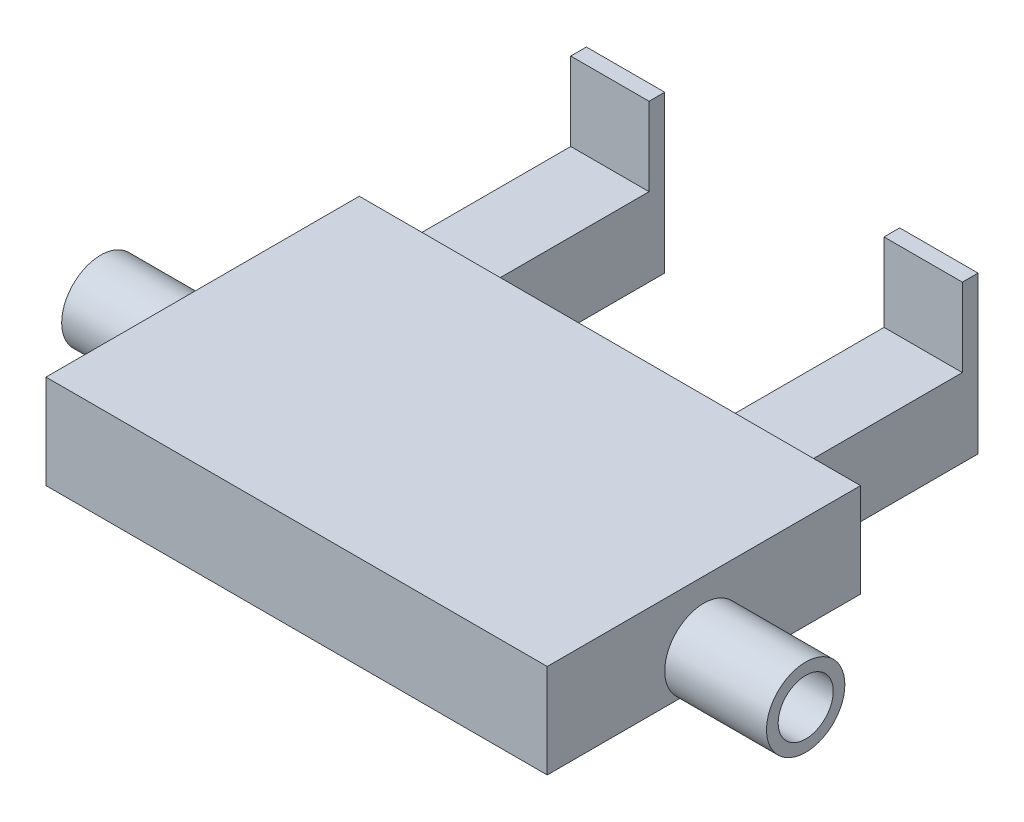
ISO-10303-21;
HEADER;
FILE_DESCRIPTION(('STEP AP214'),'2;1');
FILE_NAME('part.step','',(''),(''),'','','');
FILE_SCHEMA(('AUTOMOTIVE_DESIGN { 1 0 10303 214 1 1 1 1 }'));
ENDSEC;
DATA;
#1=APPLICATION_CONTEXT('core data for automotive mechanical design processes');
#2=APPLICATION_PROTOCOL_DEFINITION('international standard','automotive_design',2000,#1);
#3=PRODUCT_CONTEXT('',#1,'mechanical');
#4=PRODUCT('Part','Part','',(#3));
#5=PRODUCT_RELATED_PRODUCT_CATEGORY('part','',(#4));
#6=PRODUCT_DEFINITION_FORMATION('','',#4);
#7=PRODUCT_DEFINITION_CONTEXT('part definition',#1,'design');
#8=PRODUCT_DEFINITION('design','',#6,#7);
#9=PRODUCT_DEFINITION_SHAPE('','',#8);
#10=(LENGTH_UNIT() NAMED_UNIT(*) SI_UNIT(.MILLI.,.METRE.));
#11=(NAMED_UNIT(*) PLANE_ANGLE_UNIT() SI_UNIT($,.RADIAN.));
#12=(NAMED_UNIT(*) SI_UNIT($,.STERADIAN.) SOLID_ANGLE_UNIT());
#13=UNCERTAINTY_MEASURE_WITH_UNIT(LENGTH_MEASURE(1.E-05),#10,'distance_accuracy_value','');
#14=(GEOMETRIC_REPRESENTATION_CONTEXT(3) GLOBAL_UNCERTAINTY_ASSIGNED_CONTEXT((#13)) GLOBAL_UNIT_ASSIGNED_CONTEXT((#10,
#11,#12)) REPRESENTATION_CONTEXT('',''));
#15=CARTESIAN_POINT('',(0.,0.,0.));
#16=DIRECTION('',(0.,0.,1.));
#17=DIRECTION('',(1.,0.,0.));
#18=AXIS2_PLACEMENT_3D('',#15,#16,#17);
#19=CARTESIAN_POINT('',(-15.,11.,-42.));
#20=DIRECTION('',(0.,-1.,0.));
#21=DIRECTION('',(0.,0.,-1.));
#22=AXIS2_PLACEMENT_3D('',#19,#20,#21);
#23=PLANE('',#22);
#24=DIRECTION('',(1.,0.,0.));
#25=VECTOR('',#24,1.);
#26=CARTESIAN_POINT('',(-25.,11.,-40.));
#27=LINE('',#26,#25);
#28=CARTESIAN_POINT('',(-25.,11.,-40.));
#29=VERTEX_POINT('',#28);
#30=CARTESIAN_POINT('',(-15.,11.,-40.));
#31=VERTEX_POINT('',#30);
#32=EDGE_CURVE('E198',#29,#31,#27,.T.);
#33=ORIENTED_EDGE('',*,*,#32,.F.);
#34=DIRECTION('',(0.,0.,1.));
#35=VECTOR('',#34,1.);
#36=CARTESIAN_POINT('',(-25.,11.,-42.));
#37=LINE('',#36,#35);
#38=CARTESIAN_POINT('',(-25.,11.,-20.));
#39=VERTEX_POINT('',#38);
#40=EDGE_CURVE('E58',#29,#39,#37,.T.);
#41=ORIENTED_EDGE('',*,*,#40,.T.);
#42=DIRECTION('',(1.,0.,0.));
#43=VECTOR('',#42,1.);
#44=CARTESIAN_POINT('',(-15.,11.,-20.));
#45=LINE('',#44,#43);
#46=CARTESIAN_POINT('',(-15.,11.,-20.));
#47=VERTEX_POINT('',#46);
#48=EDGE_CURVE('E248',#39,#47,#45,.T.);
#49=ORIENTED_EDGE('',*,*,#48,.T.);
#50=DIRECTION('',(0.,0.,1.));
#51=VECTOR('',#50,1.);
#52=CARTESIAN_POINT('',(-15.,11.,-42.));
#53=LINE('',#52,#51);
#54=EDGE_CURVE('E66',#31,#47,#53,.T.);
#55=ORIENTED_EDGE('',*,*,#54,.F.);
#56=EDGE_LOOP('',(#33,#41,#49,#55));
#57=FACE_BOUND('',#56,.T.);
#58=ADVANCED_FACE('F39',(#57),#23,.F.);
#59=CARTESIAN_POINT('',(25.,11.,-42.));
#60=DIRECTION('',(0.,-1.,0.));
#61=DIRECTION('',(0.,0.,-1.));
#62=AXIS2_PLACEMENT_3D('',#59,#60,#61);
#63=PLANE('',#62);
#64=DIRECTION('',(1.,0.,0.));
#65=VECTOR('',#64,1.);
#66=CARTESIAN_POINT('',(25.,11.,-40.));
#67=LINE('',#66,#65);
#68=CARTESIAN_POINT('',(15.,11.,-40.));
#69=VERTEX_POINT('',#68);
#70=CARTESIAN_POINT('',(25.,11.,-40.));
#71=VERTEX_POINT('',#70);
#72=EDGE_CURVE('E213',#69,#71,#67,.T.);
#73=ORIENTED_EDGE('',*,*,#72,.F.);
#74=DIRECTION('',(0.,0.,1.));
#75=VECTOR('',#74,1.);
#76=CARTESIAN_POINT('',(15.,11.,-42.));
#77=LINE('',#76,#75);
#78=CARTESIAN_POINT('',(15.,11.,-20.));
#79=VERTEX_POINT('',#78);
#80=EDGE_CURVE('E302',#69,#79,#77,.T.);
#81=ORIENTED_EDGE('',*,*,#80,.T.);
#82=DIRECTION('',(1.,0.,0.));
#83=VECTOR('',#82,1.);
#84=CARTESIAN_POINT('',(25.,11.,-20.));
#85=LINE('',#84,#83);
#86=CARTESIAN_POINT('',(25.,11.,-20.));
#87=VERTEX_POINT('',#86);
#88=EDGE_CURVE('E281',#79,#87,#85,.T.);
#89=ORIENTED_EDGE('',*,*,#88,.T.);
#90=DIRECTION('',(0.,0.,1.));
#91=VECTOR('',#90,1.);
#92=CARTESIAN_POINT('',(25.,11.,-42.));
#93=LINE('',#92,#91);
#94=EDGE_CURVE('E299',#71,#87,#93,.T.);
#95=ORIENTED_EDGE('',*,*,#94,.F.);
#96=EDGE_LOOP('',(#73,#81,#89,#95));
#97=FACE_BOUND('',#96,.T.);
#98=ADVANCED_FACE('F425',(#97),#63,.F.);
#99=CARTESIAN_POINT('',(-32.,12.,-20.));
#100=DIRECTION('',(0.,0.,1.));
#101=DIRECTION('',(1.,0.,0.));
#102=AXIS2_PLACEMENT_3D('',#99,#100,#101);
#103=PLANE('',#102);
#104=DIRECTION('',(0.,1.,0.));
#105=VECTOR('',#104,1.);
#106=CARTESIAN_POINT('',(15.,11.,-20.));
#107=LINE('',#106,#105);
#108=CARTESIAN_POINT('',(15.,0.999999999999999,-20.));
#109=VERTEX_POINT('',#108);
#110=EDGE_CURVE('E266',#109,#79,#107,.T.);
#111=ORIENTED_EDGE('',*,*,#110,.F.);
#112=DIRECTION('',(-1.,0.,0.));
#113=VECTOR('',#112,1.);
#114=CARTESIAN_POINT('',(25.,0.999999999999999,-20.));
#115=LINE('',#114,#113);
#116=CARTESIAN_POINT('',(25.,0.999999999999999,-20.));
#117=VERTEX_POINT('',#116);
#118=EDGE_CURVE('E271',#117,#109,#115,.T.);
#119=ORIENTED_EDGE('',*,*,#118,.F.);
#120=DIRECTION('',(0.,-1.,0.));
#121=VECTOR('',#120,1.);
#122=CARTESIAN_POINT('',(25.,11.,-20.));
#123=LINE('',#122,#121);
#124=EDGE_CURVE('E285',#87,#117,#123,.T.);
#125=ORIENTED_EDGE('',*,*,#124,.F.);
#126=ORIENTED_EDGE('',*,*,#88,.F.);
#127=EDGE_LOOP('',(#111,#119,#125,#126));
#128=FACE_BOUND('',#127,.T.);
#129=DIRECTION('',(-1.,0.,0.));
#130=VECTOR('',#129,1.);
#131=CARTESIAN_POINT('',(-32.,0.,-20.));
#132=LINE('',#131,#130);
#133=CARTESIAN_POINT('',(32.,0.,-20.));
#134=VERTEX_POINT('',#133);
#135=CARTESIAN_POINT('',(-32.,0.,-20.));
#136=VERTEX_POINT('',#135);
#137=EDGE_CURVE('E354',#134,#136,#132,.T.);
#138=ORIENTED_EDGE('',*,*,#137,.T.);
#139=DIRECTION('',(0.,-1.,0.));
#140=VECTOR('',#139,1.);
#141=CARTESIAN_POINT('',(-32.,12.,-20.));
#142=LINE('',#141,#140);
#143=CARTESIAN_POINT('',(-32.,12.,-20.));
#144=VERTEX_POINT('',#143);
#145=EDGE_CURVE('E371',#144,#136,#142,.T.);
#146=ORIENTED_EDGE('',*,*,#145,.F.);
#147=DIRECTION('',(-1.,0.,0.));
#148=VECTOR('',#147,1.);
#149=CARTESIAN_POINT('',(-32.,12.,-20.));
#150=LINE('',#149,#148);
#151=CARTESIAN_POINT('',(32.,12.,-20.));
#152=VERTEX_POINT('',#151);
#153=EDGE_CURVE('E340',#152,#144,#150,.T.);
#154=ORIENTED_EDGE('',*,*,#153,.F.);
#155=DIRECTION('',(0.,-1.,0.));
#156=VECTOR('',#155,1.);
#157=CARTESIAN_POINT('',(32.,12.,-20.));
#158=LINE('',#157,#156);
#159=EDGE_CURVE('E43',#152,#134,#158,.T.);
#160=ORIENTED_EDGE('',*,*,#159,.T.);
#161=EDGE_LOOP('',(#138,#146,#154,#160));
#162=FACE_BOUND('',#161,.T.);
#163=DIRECTION('',(0.,1.,0.));
#164=VECTOR('',#163,1.);
#165=CARTESIAN_POINT('',(-25.,11.,-20.));
#166=LINE('',#165,#164);
#167=CARTESIAN_POINT('',(-25.,0.999999999999999,-20.));
#168=VERTEX_POINT('',#167);
#169=EDGE_CURVE('E238',#168,#39,#166,.T.);
#170=ORIENTED_EDGE('',*,*,#169,.F.);
#171=DIRECTION('',(-1.,0.,0.));
#172=VECTOR('',#171,1.);
#173=CARTESIAN_POINT('',(-15.,1.,-20.));
#174=LINE('',#173,#172);
#175=CARTESIAN_POINT('',(-15.,1.,-20.));
#176=VERTEX_POINT('',#175);
#177=EDGE_CURVE('E240',#176,#168,#174,.T.);
#178=ORIENTED_EDGE('',*,*,#177,.F.);
#179=DIRECTION('',(0.,-1.,0.));
#180=VECTOR('',#179,1.);
#181=CARTESIAN_POINT('',(-15.,11.,-20.));
#182=LINE('',#181,#180);
#183=EDGE_CURVE('E251',#47,#176,#182,.T.);
#184=ORIENTED_EDGE('',*,*,#183,.F.);
#185=ORIENTED_EDGE('',*,*,#48,.F.);
#186=EDGE_LOOP('',(#170,#178,#184,#185));
#187=FACE_BOUND('',#186,.T.);
#188=ADVANCED_FACE('F401',(#128,#162,#187),#103,.F.);
#189=CARTESIAN_POINT('',(32.,12.,-20.));
#190=DIRECTION('',(-1.,0.,0.));
#191=DIRECTION('',(0.,0.,1.));
#192=AXIS2_PLACEMENT_3D('',#189,#190,#191);
#193=PLANE('',#192);
#194=CARTESIAN_POINT('',(32.,4.,0.));
#195=DIRECTION('',(1.,0.,0.));
#196=DIRECTION('',(0.,0.,-1.));
#197=AXIS2_PLACEMENT_3D('',#194,#195,#196);
#198=CIRCLE('',#197,5.);
#199=CARTESIAN_POINT('',(32.,0.,-3.00000000000001));
#200=VERTEX_POINT('',#199);
#201=CARTESIAN_POINT('',(32.,0.,3.));
#202=VERTEX_POINT('',#201);
#203=EDGE_CURVE('E49',#200,#202,#198,.T.);
#204=ORIENTED_EDGE('',*,*,#203,.F.);
#205=DIRECTION('',(0.,0.,-1.));
#206=VECTOR('',#205,1.);
#207=CARTESIAN_POINT('',(32.,0.,-20.));
#208=LINE('',#207,#206);
#209=EDGE_CURVE('E332',#200,#134,#208,.T.);
#210=ORIENTED_EDGE('',*,*,#209,.T.);
#211=ORIENTED_EDGE('',*,*,#159,.F.);
#212=DIRECTION('',(0.,0.,-1.));
#213=VECTOR('',#212,1.);
#214=CARTESIAN_POINT('',(32.,12.,-20.));
#215=LINE('',#214,#213);
#216=CARTESIAN_POINT('',(32.,12.,20.));
#217=VERTEX_POINT('',#216);
#218=EDGE_CURVE('E336',#217,#152,#215,.T.);
#219=ORIENTED_EDGE('',*,*,#218,.F.);
#220=DIRECTION('',(0.,-1.,0.));
#221=VECTOR('',#220,1.);
#222=CARTESIAN_POINT('',(32.,12.,20.));
#223=LINE('',#222,#221);
#224=CARTESIAN_POINT('',(32.,0.,20.));
#225=VERTEX_POINT('',#224);
#226=EDGE_CURVE('E350',#217,#225,#223,.T.);
#227=ORIENTED_EDGE('',*,*,#226,.T.);
#228=EDGE_CURVE('E351',#225,#202,#208,.T.);
#229=ORIENTED_EDGE('',*,*,#228,.T.);
#230=EDGE_LOOP('',(#204,#210,#211,#219,#227,#229));
#231=FACE_BOUND('',#230,.T.);
#232=ADVANCED_FACE('F41',(#231),#193,.F.);
#233=CARTESIAN_POINT('',(-32.,12.,-20.));
#234=DIRECTION('',(1.,0.,0.));
#235=DIRECTION('',(0.,0.,-1.));
#236=AXIS2_PLACEMENT_3D('',#233,#234,#235);
#237=PLANE('',#236);
#238=CARTESIAN_POINT('',(-32.,4.,0.));
#239=DIRECTION('',(-1.,0.,0.));
#240=DIRECTION('',(0.,0.,1.));
#241=AXIS2_PLACEMENT_3D('',#238,#239,#240);
#242=CIRCLE('',#241,5.);
#243=CARTESIAN_POINT('',(-32.,0.,3.));
#244=VERTEX_POINT('',#243);
#245=CARTESIAN_POINT('',(-32.,0.,-3.));
#246=VERTEX_POINT('',#245);
#247=EDGE_CURVE('E11',#244,#246,#242,.T.);
#248=ORIENTED_EDGE('',*,*,#247,.F.);
#249=DIRECTION('',(0.,0.,1.));
#250=VECTOR('',#249,1.);
#251=CARTESIAN_POINT('',(-32.,0.,-20.));
#252=LINE('',#251,#250);
#253=CARTESIAN_POINT('',(-32.,0.,20.));
#254=VERTEX_POINT('',#253);
#255=EDGE_CURVE('E358',#244,#254,#252,.T.);
#256=ORIENTED_EDGE('',*,*,#255,.T.);
#257=DIRECTION('',(0.,-1.,0.));
#258=VECTOR('',#257,1.);
#259=CARTESIAN_POINT('',(-32.,12.,20.));
#260=LINE('',#259,#258);
#261=CARTESIAN_POINT('',(-32.,12.,20.));
#262=VERTEX_POINT('',#261);
#263=EDGE_CURVE('E368',#262,#254,#260,.T.);
#264=ORIENTED_EDGE('',*,*,#263,.F.);
#265=DIRECTION('',(0.,0.,1.));
#266=VECTOR('',#265,1.);
#267=CARTESIAN_POINT('',(-32.,12.,-20.));
#268=LINE('',#267,#266);
#269=EDGE_CURVE('E344',#144,#262,#268,.T.);
#270=ORIENTED_EDGE('',*,*,#269,.F.);
#271=ORIENTED_EDGE('',*,*,#145,.T.);
#272=EDGE_CURVE('E359',#136,#246,#252,.T.);
#273=ORIENTED_EDGE('',*,*,#272,.T.);
#274=EDGE_LOOP('',(#248,#256,#264,#270,#271,#273));
#275=FACE_BOUND('',#274,.T.);
#276=ADVANCED_FACE('F404',(#275),#237,.F.);
#277=CARTESIAN_POINT('',(-32.,12.,20.));
#278=DIRECTION('',(0.,0.,-1.));
#279=DIRECTION('',(-1.,0.,0.));
#280=AXIS2_PLACEMENT_3D('',#277,#278,#279);
#281=PLANE('',#280);
#282=DIRECTION('',(1.,0.,0.));
#283=VECTOR('',#282,1.);
#284=CARTESIAN_POINT('',(-32.,0.,20.));
#285=LINE('',#284,#283);
#286=EDGE_CURVE('E341',#254,#225,#285,.T.);
#287=ORIENTED_EDGE('',*,*,#286,.T.);
#288=ORIENTED_EDGE('',*,*,#226,.F.);
#289=DIRECTION('',(1.,0.,0.));
#290=VECTOR('',#289,1.);
#291=CARTESIAN_POINT('',(-32.,12.,20.));
#292=LINE('',#291,#290);
#293=EDGE_CURVE('E347',#262,#217,#292,.T.);
#294=ORIENTED_EDGE('',*,*,#293,.F.);
#295=ORIENTED_EDGE('',*,*,#263,.T.);
#296=EDGE_LOOP('',(#287,#288,#294,#295));
#297=FACE_BOUND('',#296,.T.);
#298=ADVANCED_FACE('F413',(#297),#281,.F.);
#299=CARTESIAN_POINT('',(0.,12.,0.));
#300=DIRECTION('',(0.,1.,0.));
#301=DIRECTION('',(0.,0.,1.));
#302=AXIS2_PLACEMENT_3D('',#299,#300,#301);
#303=PLANE('',#302);
#304=ORIENTED_EDGE('',*,*,#218,.T.);
#305=ORIENTED_EDGE('',*,*,#153,.T.);
#306=ORIENTED_EDGE('',*,*,#269,.T.);
#307=ORIENTED_EDGE('',*,*,#293,.T.);
#308=EDGE_LOOP('',(#304,#305,#306,#307));
#309=FACE_BOUND('',#308,.T.);
#310=ADVANCED_FACE('F407',(#309),#303,.T.);
#311=CARTESIAN_POINT('',(0.,0.,0.));
#312=DIRECTION('',(0.,1.,0.));
#313=DIRECTION('',(0.,0.,1.));
#314=AXIS2_PLACEMENT_3D('',#311,#312,#313);
#315=PLANE('',#314);
#316=ORIENTED_EDGE('',*,*,#228,.F.);
#317=ORIENTED_EDGE('',*,*,#286,.F.);
#318=ORIENTED_EDGE('',*,*,#255,.F.);
#319=EDGE_CURVE('E362',#246,#244,#252,.T.);
#320=ORIENTED_EDGE('',*,*,#319,.F.);
#321=ORIENTED_EDGE('',*,*,#272,.F.);
#322=ORIENTED_EDGE('',*,*,#137,.F.);
#323=ORIENTED_EDGE('',*,*,#209,.F.);
#324=EDGE_CURVE('E355',#202,#200,#208,.T.);
#325=ORIENTED_EDGE('',*,*,#324,.F.);
#326=EDGE_LOOP('',(#316,#317,#318,#320,#321,#322,#323,#325));
#327=FACE_BOUND('',#326,.T.);
#328=ADVANCED_FACE('F399',(#327),#315,.F.);
#329=CARTESIAN_POINT('',(32.,4.,0.));
#330=DIRECTION('',(1.,0.,0.));
#331=DIRECTION('',(0.,0.,-1.));
#332=AXIS2_PLACEMENT_3D('',#329,#330,#331);
#333=PLANE('',#332);
#334=EDGE_CURVE('E324',#202,#200,#198,.T.);
#335=ORIENTED_EDGE('',*,*,#334,.F.);
#336=ORIENTED_EDGE('',*,*,#324,.T.);
#337=EDGE_LOOP('',(#335,#336));
#338=FACE_BOUND('',#337,.T.);
#339=ADVANCED_FACE('F391',(#338),#333,.F.);
#340=CARTESIAN_POINT('',(45.,4.,0.));
#341=DIRECTION('',(1.,0.,0.));
#342=DIRECTION('',(0.,0.,-1.));
#343=AXIS2_PLACEMENT_3D('',#340,#341,#342);
#344=PLANE('',#343);
#345=CARTESIAN_POINT('',(45.,4.,0.));
#346=DIRECTION('',(1.,0.,0.));
#347=DIRECTION('',(0.,0.,-1.));
#348=AXIS2_PLACEMENT_3D('',#345,#346,#347);
#349=CIRCLE('',#348,5.);
#350=CARTESIAN_POINT('',(45.,4.,-5.00000000000001));
#351=VERTEX_POINT('',#350);
#352=EDGE_CURVE('E328',#351,#351,#349,.T.);
#353=ORIENTED_EDGE('',*,*,#352,.T.);
#354=EDGE_LOOP('',(#353));
#355=FACE_BOUND('',#354,.T.);
#356=CARTESIAN_POINT('',(45.,4.,0.));
#357=DIRECTION('',(1.,0.,0.));
#358=DIRECTION('',(0.,0.,-1.));
#359=AXIS2_PLACEMENT_3D('',#356,#357,#358);
#360=CIRCLE('',#359,3.515);
#361=CARTESIAN_POINT('',(45.,4.,3.51499999999999));
#362=VERTEX_POINT('',#361);
#363=EDGE_CURVE('E320',#362,#362,#360,.T.);
#364=ORIENTED_EDGE('',*,*,#363,.F.);
#365=EDGE_LOOP('',(#364));
#366=FACE_BOUND('',#365,.T.);
#367=ADVANCED_FACE('F476',(#355,#366),#344,.T.);
#368=CARTESIAN_POINT('',(45.,4.,0.));
#369=DIRECTION('',(-1.,0.,0.));
#370=DIRECTION('',(0.,0.,1.));
#371=AXIS2_PLACEMENT_3D('',#368,#369,#370);
#372=CYLINDRICAL_SURFACE('',#371,5.);
#373=ORIENTED_EDGE('',*,*,#352,.F.);
#374=EDGE_LOOP('',(#373));
#375=FACE_BOUND('',#374,.T.);
#376=ORIENTED_EDGE('',*,*,#334,.T.);
#377=ORIENTED_EDGE('',*,*,#203,.T.);
#378=EDGE_LOOP('',(#376,#377));
#379=FACE_BOUND('',#378,.T.);
#380=ADVANCED_FACE('F386',(#375,#379),#372,.T.);
#381=CARTESIAN_POINT('',(45.,4.,0.));
#382=DIRECTION('',(-1.,0.,0.));
#383=DIRECTION('',(0.,0.,1.));
#384=AXIS2_PLACEMENT_3D('',#381,#382,#383);
#385=CYLINDRICAL_SURFACE('',#384,3.515);
#386=CARTESIAN_POINT('',(32.,4.,0.));
#387=DIRECTION('',(1.,0.,0.));
#388=DIRECTION('',(0.,0.,-1.));
#389=AXIS2_PLACEMENT_3D('',#386,#387,#388);
#390=CIRCLE('',#389,3.515);
#391=CARTESIAN_POINT('',(32.,4.,3.51499999999999));
#392=VERTEX_POINT('',#391);
#393=EDGE_CURVE('E316',#392,#392,#390,.T.);
#394=CARTESIAN_POINT('',(45.,4.,3.51499999999999));
#395=CARTESIAN_POINT('',(44.8645833333333,4.,3.51499999999999));
#396=CARTESIAN_POINT('',(44.7291666666667,4.,3.51499999999999));
#397=CARTESIAN_POINT('',(44.4583333333333,4.,3.51499999999999));
#398=CARTESIAN_POINT('',(44.3229166666667,4.,3.51499999999999));
#399=CARTESIAN_POINT('',(44.0520833333333,4.,3.51499999999999));
#400=CARTESIAN_POINT('',(43.9166666666667,4.,3.51499999999999));
#401=CARTESIAN_POINT('',(43.6458333333333,4.,3.51499999999999));
#402=CARTESIAN_POINT('',(43.5104166666667,4.,3.51499999999999));
#403=CARTESIAN_POINT('',(43.2395833333333,4.,3.51499999999999));
#404=CARTESIAN_POINT('',(43.1041666666667,4.,3.51499999999999));
#405=CARTESIAN_POINT('',(42.8333333333333,4.,3.51499999999999));
#406=CARTESIAN_POINT('',(42.6979166666667,4.,3.51499999999999));
#407=CARTESIAN_POINT('',(42.4270833333333,4.,3.51499999999999));
#408=CARTESIAN_POINT('',(42.2916666666667,4.,3.51499999999999));
#409=CARTESIAN_POINT('',(42.0208333333333,4.,3.51499999999999));
#410=CARTESIAN_POINT('',(41.8854166666667,4.,3.51499999999999));
#411=CARTESIAN_POINT('',(41.6145833333333,4.,3.51499999999999));
#412=CARTESIAN_POINT('',(41.4791666666667,4.,3.51499999999999));
#413=CARTESIAN_POINT('',(41.2083333333333,4.,3.51499999999999));
#414=CARTESIAN_POINT('',(41.0729166666667,4.,3.51499999999999));
#415=CARTESIAN_POINT('',(40.8020833333333,4.,3.51499999999999));
#416=CARTESIAN_POINT('',(40.6666666666667,4.,3.51499999999999));
#417=CARTESIAN_POINT('',(40.3958333333333,4.,3.51499999999999));
#418=CARTESIAN_POINT('',(40.2604166666667,4.,3.51499999999999));
#419=CARTESIAN_POINT('',(39.9895833333333,4.,3.51499999999999));
#420=CARTESIAN_POINT('',(39.8541666666667,4.,3.51499999999999));
#421=CARTESIAN_POINT('',(39.5833333333333,4.,3.51499999999999));
#422=CARTESIAN_POINT('',(39.4479166666667,4.,3.51499999999999));
#423=CARTESIAN_POINT('',(39.1770833333333,4.,3.51499999999999));
#424=CARTESIAN_POINT('',(39.0416666666667,4.,3.51499999999999));
#425=CARTESIAN_POINT('',(38.7708333333333,4.,3.51499999999999));
#426=CARTESIAN_POINT('',(38.6354166666667,4.,3.51499999999999));
#427=CARTESIAN_POINT('',(38.3645833333333,4.,3.51499999999999));
#428=CARTESIAN_POINT('',(38.2291666666667,4.,3.51499999999999));
#429=CARTESIAN_POINT('',(37.9583333333333,4.,3.51499999999999));
#430=CARTESIAN_POINT('',(37.8229166666667,4.,3.51499999999999));
#431=CARTESIAN_POINT('',(37.5520833333333,4.,3.51499999999999));
#432=CARTESIAN_POINT('',(37.4166666666667,4.,3.51499999999999));
#433=CARTESIAN_POINT('',(37.1458333333333,4.,3.51499999999999));
#434=CARTESIAN_POINT('',(37.0104166666667,4.,3.51499999999999));
#435=CARTESIAN_POINT('',(36.7395833333333,4.,3.51499999999999));
#436=CARTESIAN_POINT('',(36.6041666666667,4.,3.51499999999999));
#437=CARTESIAN_POINT('',(36.3333333333333,4.,3.51499999999999));
#438=CARTESIAN_POINT('',(36.1979166666667,4.,3.51499999999999));
#439=CARTESIAN_POINT('',(35.9270833333333,4.,3.51499999999999));
#440=CARTESIAN_POINT('',(35.7916666666667,4.,3.51499999999999));
#441=CARTESIAN_POINT('',(35.5208333333333,4.,3.51499999999999));
#442=CARTESIAN_POINT('',(35.3854166666667,4.,3.51499999999999));
#443=CARTESIAN_POINT('',(35.1145833333333,4.,3.51499999999999));
#444=CARTESIAN_POINT('',(34.9791666666667,4.,3.51499999999999));
#445=CARTESIAN_POINT('',(34.7083333333333,4.,3.51499999999999));
#446=CARTESIAN_POINT('',(34.5729166666667,4.,3.51499999999999));
#447=CARTESIAN_POINT('',(34.3020833333333,4.,3.51499999999999));
#448=CARTESIAN_POINT('',(34.1666666666667,4.,3.51499999999999));
#449=CARTESIAN_POINT('',(33.8958333333333,4.,3.51499999999999));
#450=CARTESIAN_POINT('',(33.7604166666667,4.,3.51499999999999));
#451=CARTESIAN_POINT('',(33.4895833333333,4.,3.51499999999999));
#452=CARTESIAN_POINT('',(33.3541666666667,4.,3.51499999999999));
#453=CARTESIAN_POINT('',(33.0833333333333,4.,3.51499999999999));
#454=CARTESIAN_POINT('',(32.9479166666667,4.,3.51499999999999));
#455=CARTESIAN_POINT('',(32.6770833333333,4.,3.51499999999999));
#456=CARTESIAN_POINT('',(32.5416666666667,4.,3.51499999999999));
#457=CARTESIAN_POINT('',(32.2708333333333,4.,3.51499999999999));
#458=CARTESIAN_POINT('',(32.1354166666667,4.,3.51499999999999));
#459=CARTESIAN_POINT('',(32.,4.,3.51499999999999));
#460=B_SPLINE_CURVE_WITH_KNOTS('',3,(#394,#395,#396,#397,#398,#399,#400,#401,#402,#403,#404,
#405,#406,#407,#408,#409,#410,#411,#412,#413,#414,#415,#416,#417,#418,#419,#420,#421,#422,#423,
#424,#425,#426,#427,#428,#429,#430,#431,#432,#433,#434,#435,#436,#437,#438,#439,#440,#441,#442,
#443,#444,#445,#446,#447,#448,#449,#450,#451,#452,#453,#454,#455,#456,#457,#458,#459),
.UNSPECIFIED.,.F.,.F.,(4,2,2,2,2,2,2,2,2,2,2,2,2,2,2,2,2,2,2,2,2,2,2,2,2,2,2,2,2,2,2,2,4),(0.,
0.406250000000004,0.812500000000001,1.21875,1.625,2.03125000000001,2.4375,2.84375,3.25,3.65625,
4.0625,4.46875,4.875,5.28125,5.68750000000001,6.09375,6.5,6.90625,7.3125,7.71875,8.125,8.53125,
8.9375,9.34375,9.75,10.15625,10.5625,10.96875,11.375,11.78125,12.1875,12.59375,13.),.UNSPECIFIED.);
#461=EDGE_CURVE('BSEAM472',#362,#392,#460,.T.);
#462=ORIENTED_EDGE('',*,*,#363,.T.);
#463=ORIENTED_EDGE('',*,*,#393,.F.);
#464=ORIENTED_EDGE('',*,*,#461,.T.);
#465=ORIENTED_EDGE('',*,*,#461,.F.);
#466=EDGE_LOOP('',(#462,#464,#463,#465));
#467=FACE_BOUND('',#466,.T.);
#468=ADVANCED_FACE('F472',(#467),#385,.F.);
#469=ORIENTED_EDGE('',*,*,#393,.T.);
#470=EDGE_LOOP('',(#469));
#471=FACE_BOUND('',#470,.T.);
#472=ADVANCED_FACE('F467',(#471),#193,.F.);
#473=CARTESIAN_POINT('',(-32.,4.,0.));
#474=DIRECTION('',(-1.,0.,0.));
#475=DIRECTION('',(0.,0.,1.));
#476=AXIS2_PLACEMENT_3D('',#473,#474,#475);
#477=PLANE('',#476);
#478=EDGE_CURVE('E51',#246,#244,#242,.T.);
#479=ORIENTED_EDGE('',*,*,#478,.F.);
#480=ORIENTED_EDGE('',*,*,#319,.T.);
#481=EDGE_LOOP('',(#479,#480));
#482=FACE_BOUND('',#481,.T.);
#483=ADVANCED_FACE('F463',(#482),#477,.F.);
#484=CARTESIAN_POINT('',(-45.,4.,0.));
#485=DIRECTION('',(-1.,0.,0.));
#486=DIRECTION('',(0.,0.,1.));
#487=AXIS2_PLACEMENT_3D('',#484,#485,#486);
#488=PLANE('',#487);
#489=CARTESIAN_POINT('',(-45.,4.,0.));
#490=DIRECTION('',(-1.,0.,0.));
#491=DIRECTION('',(0.,0.,1.));
#492=AXIS2_PLACEMENT_3D('',#489,#490,#491);
#493=CIRCLE('',#492,5.);
#494=CARTESIAN_POINT('',(-45.,4.,5.));
#495=VERTEX_POINT('',#494);
#496=EDGE_CURVE('E313',#495,#495,#493,.T.);
#497=ORIENTED_EDGE('',*,*,#496,.T.);
#498=EDGE_LOOP('',(#497));
#499=FACE_BOUND('',#498,.T.);
#500=CARTESIAN_POINT('',(-45.,4.,0.));
#501=DIRECTION('',(-1.,0.,0.));
#502=DIRECTION('',(0.,0.,1.));
#503=AXIS2_PLACEMENT_3D('',#500,#501,#502);
#504=CIRCLE('',#503,3.515);
#505=CARTESIAN_POINT('',(-45.,4.,-3.515));
#506=VERTEX_POINT('',#505);
#507=EDGE_CURVE('E306',#506,#506,#504,.T.);
#508=ORIENTED_EDGE('',*,*,#507,.F.);
#509=EDGE_LOOP('',(#508));
#510=FACE_BOUND('',#509,.T.);
#511=ADVANCED_FACE('F460',(#499,#510),#488,.T.);
#512=CARTESIAN_POINT('',(-45.,4.,0.));
#513=DIRECTION('',(1.,0.,0.));
#514=DIRECTION('',(0.,0.,-1.));
#515=AXIS2_PLACEMENT_3D('',#512,#513,#514);
#516=CYLINDRICAL_SURFACE('',#515,5.);
#517=ORIENTED_EDGE('',*,*,#496,.F.);
#518=EDGE_LOOP('',(#517));
#519=FACE_BOUND('',#518,.T.);
#520=ORIENTED_EDGE('',*,*,#478,.T.);
#521=ORIENTED_EDGE('',*,*,#247,.T.);
#522=EDGE_LOOP('',(#520,#521));
#523=FACE_BOUND('',#522,.T.);
#524=ADVANCED_FACE('F458',(#519,#523),#516,.T.);
#525=CARTESIAN_POINT('',(-45.,4.,0.));
#526=DIRECTION('',(1.,0.,0.));
#527=DIRECTION('',(0.,0.,-1.));
#528=AXIS2_PLACEMENT_3D('',#525,#526,#527);
#529=CYLINDRICAL_SURFACE('',#528,3.515);
#530=CARTESIAN_POINT('',(-32.,4.,0.));
#531=DIRECTION('',(-1.,0.,0.));
#532=DIRECTION('',(0.,0.,1.));
#533=AXIS2_PLACEMENT_3D('',#530,#531,#532);
#534=CIRCLE('',#533,3.515);
#535=CARTESIAN_POINT('',(-32.,4.,-3.515));
#536=VERTEX_POINT('',#535);
#537=EDGE_CURVE('E305',#536,#536,#534,.T.);
#538=CARTESIAN_POINT('',(-45.,4.,-3.515));
#539=CARTESIAN_POINT('',(-44.8645833333333,4.,-3.515));
#540=CARTESIAN_POINT('',(-44.7291666666667,4.,-3.515));
#541=CARTESIAN_POINT('',(-44.4583333333333,4.,-3.515));
#542=CARTESIAN_POINT('',(-44.3229166666667,4.,-3.515));
#543=CARTESIAN_POINT('',(-44.0520833333333,4.,-3.515));
#544=CARTESIAN_POINT('',(-43.9166666666667,4.,-3.515));
#545=CARTESIAN_POINT('',(-43.6458333333333,4.,-3.515));
#546=CARTESIAN_POINT('',(-43.5104166666667,4.,-3.515));
#547=CARTESIAN_POINT('',(-43.2395833333333,4.,-3.515));
#548=CARTESIAN_POINT('',(-43.1041666666667,4.,-3.515));
#549=CARTESIAN_POINT('',(-42.8333333333333,4.,-3.515));
#550=CARTESIAN_POINT('',(-42.6979166666667,4.,-3.515));
#551=CARTESIAN_POINT('',(-42.4270833333333,4.,-3.515));
#552=CARTESIAN_POINT('',(-42.2916666666667,4.,-3.515));
#553=CARTESIAN_POINT('',(-42.0208333333333,4.,-3.515));
#554=CARTESIAN_POINT('',(-41.8854166666667,4.,-3.515));
#555=CARTESIAN_POINT('',(-41.6145833333333,4.,-3.515));
#556=CARTESIAN_POINT('',(-41.4791666666667,4.,-3.515));
#557=CARTESIAN_POINT('',(-41.2083333333333,4.,-3.515));
#558=CARTESIAN_POINT('',(-41.0729166666667,4.,-3.515));
#559=CARTESIAN_POINT('',(-40.8020833333333,4.,-3.515));
#560=CARTESIAN_POINT('',(-40.6666666666667,4.,-3.515));
#561=CARTESIAN_POINT('',(-40.3958333333333,4.,-3.515));
#562=CARTESIAN_POINT('',(-40.2604166666667,4.,-3.515));
#563=CARTESIAN_POINT('',(-39.9895833333333,4.,-3.515));
#564=CARTESIAN_POINT('',(-39.8541666666667,4.,-3.515));
#565=CARTESIAN_POINT('',(-39.5833333333333,4.,-3.515));
#566=CARTESIAN_POINT('',(-39.4479166666667,4.,-3.515));
#567=CARTESIAN_POINT('',(-39.1770833333333,4.,-3.515));
#568=CARTESIAN_POINT('',(-39.0416666666667,4.,-3.515));
#569=CARTESIAN_POINT('',(-38.7708333333333,4.,-3.515));
#570=CARTESIAN_POINT('',(-38.6354166666667,4.,-3.515));
#571=CARTESIAN_POINT('',(-38.3645833333333,4.,-3.515));
#572=CARTESIAN_POINT('',(-38.2291666666667,4.,-3.515));
#573=CARTESIAN_POINT('',(-37.9583333333333,4.,-3.515));
#574=CARTESIAN_POINT('',(-37.8229166666667,4.,-3.515));
#575=CARTESIAN_POINT('',(-37.5520833333333,4.,-3.515));
#576=CARTESIAN_POINT('',(-37.4166666666667,4.,-3.515));
#577=CARTESIAN_POINT('',(-37.1458333333333,4.,-3.515));
#578=CARTESIAN_POINT('',(-37.0104166666667,4.,-3.515));
#579=CARTESIAN_POINT('',(-36.7395833333333,4.,-3.515));
#580=CARTESIAN_POINT('',(-36.6041666666667,4.,-3.515));
#581=CARTESIAN_POINT('',(-36.3333333333333,4.,-3.515));
#582=CARTESIAN_POINT('',(-36.1979166666667,4.,-3.515));
#583=CARTESIAN_POINT('',(-35.9270833333333,4.,-3.515));
#584=CARTESIAN_POINT('',(-35.7916666666667,4.,-3.515));
#585=CARTESIAN_POINT('',(-35.5208333333333,4.,-3.515));
#586=CARTESIAN_POINT('',(-35.3854166666667,4.,-3.515));
#587=CARTESIAN_POINT('',(-35.1145833333333,4.,-3.515));
#588=CARTESIAN_POINT('',(-34.9791666666667,4.,-3.515));
#589=CARTESIAN_POINT('',(-34.7083333333333,4.,-3.515));
#590=CARTESIAN_POINT('',(-34.5729166666667,4.,-3.515));
#591=CARTESIAN_POINT('',(-34.3020833333333,4.,-3.515));
#592=CARTESIAN_POINT('',(-34.1666666666667,4.,-3.515));
#593=CARTESIAN_POINT('',(-33.8958333333333,4.,-3.515));
#594=CARTESIAN_POINT('',(-33.7604166666667,4.,-3.515));
#595=CARTESIAN_POINT('',(-33.4895833333333,4.,-3.515));
#596=CARTESIAN_POINT('',(-33.3541666666667,4.,-3.515));
#597=CARTESIAN_POINT('',(-33.0833333333333,4.,-3.515));
#598=CARTESIAN_POINT('',(-32.9479166666667,4.,-3.515));
#599=CARTESIAN_POINT('',(-32.6770833333333,4.,-3.515));
#600=CARTESIAN_POINT('',(-32.5416666666667,4.,-3.515));
#601=CARTESIAN_POINT('',(-32.2708333333333,4.,-3.515));
#602=CARTESIAN_POINT('',(-32.1354166666667,4.,-3.515));
#603=CARTESIAN_POINT('',(-32.,4.,-3.515));
#604=B_SPLINE_CURVE_WITH_KNOTS('',3,(#538,#539,#540,#541,#542,#543,#544,#545,#546,#547,#548,
#549,#550,#551,#552,#553,#554,#555,#556,#557,#558,#559,#560,#561,#562,#563,#564,#565,#566,#567,
#568,#569,#570,#571,#572,#573,#574,#575,#576,#577,#578,#579,#580,#581,#582,#583,#584,#585,#586,
#587,#588,#589,#590,#591,#592,#593,#594,#595,#596,#597,#598,#599,#600,#601,#602,#603),
.UNSPECIFIED.,.F.,.F.,(4,2,2,2,2,2,2,2,2,2,2,2,2,2,2,2,2,2,2,2,2,2,2,2,2,2,2,2,2,2,2,2,4),(0.,
0.406250000000004,0.812500000000001,1.21875,1.625,2.03125000000001,2.4375,2.84375,3.25,3.65625,
4.0625,4.46875,4.875,5.28125,5.68750000000001,6.09375,6.5,6.90625,7.3125,7.71875,8.125,8.53125,
8.9375,9.34375,9.75,10.15625,10.5625,10.96875,11.375,11.78125,12.1875,12.59375,13.),.UNSPECIFIED.);
#605=EDGE_CURVE('BSEAM455',#506,#536,#604,.T.);
#606=ORIENTED_EDGE('',*,*,#507,.T.);
#607=ORIENTED_EDGE('',*,*,#537,.F.);
#608=ORIENTED_EDGE('',*,*,#605,.T.);
#609=ORIENTED_EDGE('',*,*,#605,.F.);
#610=EDGE_LOOP('',(#606,#608,#607,#609));
#611=FACE_BOUND('',#610,.T.);
#612=ADVANCED_FACE('F455',(#611),#529,.F.);
#613=ORIENTED_EDGE('',*,*,#537,.T.);
#614=EDGE_LOOP('',(#613));
#615=FACE_BOUND('',#614,.T.);
#616=ADVANCED_FACE('F422',(#615),#237,.F.);
#617=CARTESIAN_POINT('',(15.,11.,-42.));
#618=DIRECTION('',(1.,0.,0.));
#619=DIRECTION('',(0.,0.,-1.));
#620=AXIS2_PLACEMENT_3D('',#617,#618,#619);
#621=PLANE('',#620);
#622=ORIENTED_EDGE('',*,*,#110,.T.);
#623=ORIENTED_EDGE('',*,*,#80,.F.);
#624=DIRECTION('',(0.,-1.,0.));
#625=VECTOR('',#624,1.);
#626=CARTESIAN_POINT('',(15.,21.,-40.));
#627=LINE('',#626,#625);
#628=CARTESIAN_POINT('',(15.,21.,-40.));
#629=VERTEX_POINT('',#628);
#630=EDGE_CURVE('E235',#629,#69,#627,.T.);
#631=ORIENTED_EDGE('',*,*,#630,.F.);
#632=DIRECTION('',(0.,0.,1.));
#633=VECTOR('',#632,1.);
#634=CARTESIAN_POINT('',(15.,21.,-40.));
#635=LINE('',#634,#633);
#636=CARTESIAN_POINT('',(15.,21.,-42.));
#637=VERTEX_POINT('',#636);
#638=EDGE_CURVE('E214',#637,#629,#635,.T.);
#639=ORIENTED_EDGE('',*,*,#638,.F.);
#640=DIRECTION('',(0.,1.,0.));
#641=VECTOR('',#640,1.);
#642=CARTESIAN_POINT('',(15.,11.,-42.));
#643=LINE('',#642,#641);
#644=CARTESIAN_POINT('',(15.,0.999999999999999,-42.));
#645=VERTEX_POINT('',#644);
#646=EDGE_CURVE('E267',#645,#637,#643,.T.);
#647=ORIENTED_EDGE('',*,*,#646,.F.);
#648=DIRECTION('',(0.,0.,1.));
#649=VECTOR('',#648,1.);
#650=CARTESIAN_POINT('',(15.,0.999999999999999,-42.));
#651=LINE('',#650,#649);
#652=EDGE_CURVE('E277',#645,#109,#651,.T.);
#653=ORIENTED_EDGE('',*,*,#652,.T.);
#654=EDGE_LOOP('',(#622,#623,#631,#639,#647,#653));
#655=FACE_BOUND('',#654,.T.);
#656=ADVANCED_FACE('F449',(#655),#621,.F.);
#657=CARTESIAN_POINT('',(25.,11.,-42.));
#658=DIRECTION('',(-1.,0.,0.));
#659=DIRECTION('',(0.,0.,1.));
#660=AXIS2_PLACEMENT_3D('',#657,#658,#659);
#661=PLANE('',#660);
#662=ORIENTED_EDGE('',*,*,#124,.T.);
#663=DIRECTION('',(0.,0.,1.));
#664=VECTOR('',#663,1.);
#665=CARTESIAN_POINT('',(25.,0.999999999999999,-42.));
#666=LINE('',#665,#664);
#667=CARTESIAN_POINT('',(25.,0.999999999999999,-42.));
#668=VERTEX_POINT('',#667);
#669=EDGE_CURVE('E295',#668,#117,#666,.T.);
#670=ORIENTED_EDGE('',*,*,#669,.F.);
#671=DIRECTION('',(0.,-1.,0.));
#672=VECTOR('',#671,1.);
#673=CARTESIAN_POINT('',(25.,11.,-42.));
#674=LINE('',#673,#672);
#675=CARTESIAN_POINT('',(25.,21.,-42.));
#676=VERTEX_POINT('',#675);
#677=EDGE_CURVE('E270',#676,#668,#674,.T.);
#678=ORIENTED_EDGE('',*,*,#677,.F.);
#679=DIRECTION('',(0.,0.,-1.));
#680=VECTOR('',#679,1.);
#681=CARTESIAN_POINT('',(25.,21.,-42.));
#682=LINE('',#681,#680);
#683=CARTESIAN_POINT('',(25.,21.,-40.));
#684=VERTEX_POINT('',#683);
#685=EDGE_CURVE('E221',#684,#676,#682,.T.);
#686=ORIENTED_EDGE('',*,*,#685,.F.);
#687=DIRECTION('',(0.,-1.,0.));
#688=VECTOR('',#687,1.);
#689=CARTESIAN_POINT('',(25.,21.,-40.));
#690=LINE('',#689,#688);
#691=EDGE_CURVE('E229',#684,#71,#690,.T.);
#692=ORIENTED_EDGE('',*,*,#691,.T.);
#693=ORIENTED_EDGE('',*,*,#94,.T.);
#694=EDGE_LOOP('',(#662,#670,#678,#686,#692,#693));
#695=FACE_BOUND('',#694,.T.);
#696=ADVANCED_FACE('F446',(#695),#661,.F.);
#697=CARTESIAN_POINT('',(25.,0.999999999999999,-42.));
#698=DIRECTION('',(0.,1.,0.));
#699=DIRECTION('',(0.,0.,1.));
#700=AXIS2_PLACEMENT_3D('',#697,#698,#699);
#701=PLANE('',#700);
#702=ORIENTED_EDGE('',*,*,#118,.T.);
#703=ORIENTED_EDGE('',*,*,#652,.F.);
#704=DIRECTION('',(-1.,0.,0.));
#705=VECTOR('',#704,1.);
#706=CARTESIAN_POINT('',(25.,0.999999999999999,-42.));
#707=LINE('',#706,#705);
#708=EDGE_CURVE('E274',#668,#645,#707,.T.);
#709=ORIENTED_EDGE('',*,*,#708,.F.);
#710=ORIENTED_EDGE('',*,*,#669,.T.);
#711=EDGE_LOOP('',(#702,#703,#709,#710));
#712=FACE_BOUND('',#711,.T.);
#713=ADVANCED_FACE('F442',(#712),#701,.F.);
#714=CARTESIAN_POINT('',(0.,0.,-42.));
#715=DIRECTION('',(0.,0.,-1.));
#716=DIRECTION('',(-1.,0.,0.));
#717=AXIS2_PLACEMENT_3D('',#714,#715,#716);
#718=PLANE('',#717);
#719=ORIENTED_EDGE('',*,*,#646,.T.);
#720=DIRECTION('',(-1.,0.,0.));
#721=VECTOR('',#720,1.);
#722=CARTESIAN_POINT('',(15.,21.,-42.));
#723=LINE('',#722,#721);
#724=EDGE_CURVE('E225',#676,#637,#723,.T.);
#725=ORIENTED_EDGE('',*,*,#724,.F.);
#726=ORIENTED_EDGE('',*,*,#677,.T.);
#727=ORIENTED_EDGE('',*,*,#708,.T.);
#728=EDGE_LOOP('',(#719,#725,#726,#727));
#729=FACE_BOUND('',#728,.T.);
#730=ADVANCED_FACE('F438',(#729),#718,.T.);
#731=CARTESIAN_POINT('',(-25.,11.,-42.));
#732=DIRECTION('',(1.,0.,0.));
#733=DIRECTION('',(0.,0.,-1.));
#734=AXIS2_PLACEMENT_3D('',#731,#732,#733);
#735=PLANE('',#734);
#736=ORIENTED_EDGE('',*,*,#169,.T.);
#737=ORIENTED_EDGE('',*,*,#40,.F.);
#738=DIRECTION('',(0.,-1.,0.));
#739=VECTOR('',#738,1.);
#740=CARTESIAN_POINT('',(-25.,21.,-40.));
#741=LINE('',#740,#739);
#742=CARTESIAN_POINT('',(-25.,21.,-40.));
#743=VERTEX_POINT('',#742);
#744=EDGE_CURVE('E210',#743,#29,#741,.T.);
#745=ORIENTED_EDGE('',*,*,#744,.F.);
#746=DIRECTION('',(0.,0.,1.));
#747=VECTOR('',#746,1.);
#748=CARTESIAN_POINT('',(-25.,21.,-42.));
#749=LINE('',#748,#747);
#750=CARTESIAN_POINT('',(-25.,21.,-42.));
#751=VERTEX_POINT('',#750);
#752=EDGE_CURVE('E191',#751,#743,#749,.T.);
#753=ORIENTED_EDGE('',*,*,#752,.F.);
#754=DIRECTION('',(0.,1.,0.));
#755=VECTOR('',#754,1.);
#756=CARTESIAN_POINT('',(-25.,11.,-42.));
#757=LINE('',#756,#755);
#758=CARTESIAN_POINT('',(-25.,0.999999999999999,-42.));
#759=VERTEX_POINT('',#758);
#760=EDGE_CURVE('E182',#759,#751,#757,.T.);
#761=ORIENTED_EDGE('',*,*,#760,.F.);
#762=DIRECTION('',(0.,0.,1.));
#763=VECTOR('',#762,1.);
#764=CARTESIAN_POINT('',(-25.,0.999999999999999,-42.));
#765=LINE('',#764,#763);
#766=EDGE_CURVE('E244',#759,#168,#765,.T.);
#767=ORIENTED_EDGE('',*,*,#766,.T.);
#768=EDGE_LOOP('',(#736,#737,#745,#753,#761,#767));
#769=FACE_BOUND('',#768,.T.);
#770=ADVANCED_FACE('F435',(#769),#735,.F.);
#771=CARTESIAN_POINT('',(-15.,11.,-42.));
#772=DIRECTION('',(-1.,0.,0.));
#773=DIRECTION('',(0.,-1.,0.));
#774=AXIS2_PLACEMENT_3D('',#771,#772,#773);
#775=PLANE('',#774);
#776=ORIENTED_EDGE('',*,*,#183,.T.);
#777=DIRECTION('',(0.,0.,1.));
#778=VECTOR('',#777,1.);
#779=CARTESIAN_POINT('',(-15.,1.,-42.));
#780=LINE('',#779,#778);
#781=CARTESIAN_POINT('',(-15.,1.,-42.));
#782=VERTEX_POINT('',#781);
#783=EDGE_CURVE('E177',#782,#176,#780,.T.);
#784=ORIENTED_EDGE('',*,*,#783,.F.);
#785=DIRECTION('',(0.,-1.,0.));
#786=VECTOR('',#785,1.);
#787=CARTESIAN_POINT('',(-15.,11.,-42.));
#788=LINE('',#787,#786);
#789=CARTESIAN_POINT('',(-15.,21.,-42.));
#790=VERTEX_POINT('',#789);
#791=EDGE_CURVE('E171',#790,#782,#788,.T.);
#792=ORIENTED_EDGE('',*,*,#791,.F.);
#793=DIRECTION('',(0.,0.,-1.));
#794=VECTOR('',#793,1.);
#795=CARTESIAN_POINT('',(-15.,21.,-40.));
#796=LINE('',#795,#794);
#797=CARTESIAN_POINT('',(-15.,21.,-40.));
#798=VERTEX_POINT('',#797);
#799=EDGE_CURVE('E175',#798,#790,#796,.T.);
#800=ORIENTED_EDGE('',*,*,#799,.F.);
#801=DIRECTION('',(0.,-1.,0.));
#802=VECTOR('',#801,1.);
#803=CARTESIAN_POINT('',(-15.,21.,-40.));
#804=LINE('',#803,#802);
#805=EDGE_CURVE('E206',#798,#31,#804,.T.);
#806=ORIENTED_EDGE('',*,*,#805,.T.);
#807=ORIENTED_EDGE('',*,*,#54,.T.);
#808=EDGE_LOOP('',(#776,#784,#792,#800,#806,#807));
#809=FACE_BOUND('',#808,.T.);
#810=ADVANCED_FACE('F173',(#809),#775,.F.);
#811=CARTESIAN_POINT('',(-15.,1.,-42.));
#812=DIRECTION('',(0.,1.,0.));
#813=DIRECTION('',(-1.,0.,0.));
#814=AXIS2_PLACEMENT_3D('',#811,#812,#813);
#815=PLANE('',#814);
#816=ORIENTED_EDGE('',*,*,#177,.T.);
#817=ORIENTED_EDGE('',*,*,#766,.F.);
#818=DIRECTION('',(-1.,0.,0.));
#819=VECTOR('',#818,1.);
#820=CARTESIAN_POINT('',(-15.,1.,-42.));
#821=LINE('',#820,#819);
#822=EDGE_CURVE('E181',#782,#759,#821,.T.);
#823=ORIENTED_EDGE('',*,*,#822,.F.);
#824=ORIENTED_EDGE('',*,*,#783,.T.);
#825=EDGE_LOOP('',(#816,#817,#823,#824));
#826=FACE_BOUND('',#825,.T.);
#827=ADVANCED_FACE('F564',(#826),#815,.F.);
#828=CARTESIAN_POINT('',(0.,0.,-42.));
#829=DIRECTION('',(0.,0.,-1.));
#830=DIRECTION('',(-1.,0.,0.));
#831=AXIS2_PLACEMENT_3D('',#828,#829,#830);
#832=PLANE('',#831);
#833=ORIENTED_EDGE('',*,*,#760,.T.);
#834=DIRECTION('',(-1.,0.,0.));
#835=VECTOR('',#834,1.);
#836=CARTESIAN_POINT('',(-15.,21.,-42.));
#837=LINE('',#836,#835);
#838=EDGE_CURVE('E185',#790,#751,#837,.T.);
#839=ORIENTED_EDGE('',*,*,#838,.F.);
#840=ORIENTED_EDGE('',*,*,#791,.T.);
#841=ORIENTED_EDGE('',*,*,#822,.T.);
#842=EDGE_LOOP('',(#833,#839,#840,#841));
#843=FACE_BOUND('',#842,.T.);
#844=ADVANCED_FACE('F186',(#843),#832,.T.);
#845=CARTESIAN_POINT('',(25.,21.,-40.));
#846=DIRECTION('',(0.,0.,-1.));
#847=DIRECTION('',(-1.,0.,0.));
#848=AXIS2_PLACEMENT_3D('',#845,#846,#847);
#849=PLANE('',#848);
#850=ORIENTED_EDGE('',*,*,#72,.T.);
#851=ORIENTED_EDGE('',*,*,#691,.F.);
#852=DIRECTION('',(1.,0.,0.));
#853=VECTOR('',#852,1.);
#854=CARTESIAN_POINT('',(25.,21.,-40.));
#855=LINE('',#854,#853);
#856=EDGE_CURVE('E218',#629,#684,#855,.T.);
#857=ORIENTED_EDGE('',*,*,#856,.F.);
#858=ORIENTED_EDGE('',*,*,#630,.T.);
#859=EDGE_LOOP('',(#850,#851,#857,#858));
#860=FACE_BOUND('',#859,.T.);
#861=ADVANCED_FACE('F575',(#860),#849,.F.);
#862=CARTESIAN_POINT('',(0.,21.,0.));
#863=DIRECTION('',(0.,-1.,0.));
#864=DIRECTION('',(0.,0.,-1.));
#865=AXIS2_PLACEMENT_3D('',#862,#863,#864);
#866=PLANE('',#865);
#867=ORIENTED_EDGE('',*,*,#638,.T.);
#868=ORIENTED_EDGE('',*,*,#856,.T.);
#869=ORIENTED_EDGE('',*,*,#685,.T.);
#870=ORIENTED_EDGE('',*,*,#724,.T.);
#871=EDGE_LOOP('',(#867,#868,#869,#870));
#872=FACE_BOUND('',#871,.T.);
#873=ADVANCED_FACE('F582',(#872),#866,.F.);
#874=CARTESIAN_POINT('',(-25.,21.,-40.));
#875=DIRECTION('',(0.,0.,-1.));
#876=DIRECTION('',(-1.,0.,0.));
#877=AXIS2_PLACEMENT_3D('',#874,#875,#876);
#878=PLANE('',#877);
#879=ORIENTED_EDGE('',*,*,#32,.T.);
#880=ORIENTED_EDGE('',*,*,#805,.F.);
#881=DIRECTION('',(1.,0.,0.));
#882=VECTOR('',#881,1.);
#883=CARTESIAN_POINT('',(-25.,21.,-40.));
#884=LINE('',#883,#882);
#885=EDGE_CURVE('E195',#743,#798,#884,.T.);
#886=ORIENTED_EDGE('',*,*,#885,.F.);
#887=ORIENTED_EDGE('',*,*,#744,.T.);
#888=EDGE_LOOP('',(#879,#880,#886,#887));
#889=FACE_BOUND('',#888,.T.);
#890=ADVANCED_FACE('F590',(#889),#878,.F.);
#891=CARTESIAN_POINT('',(0.,21.,0.));
#892=DIRECTION('',(0.,1.,0.));
#893=DIRECTION('',(0.,0.,1.));
#894=AXIS2_PLACEMENT_3D('',#891,#892,#893);
#895=PLANE('',#894);
#896=ORIENTED_EDGE('',*,*,#799,.T.);
#897=ORIENTED_EDGE('',*,*,#838,.T.);
#898=ORIENTED_EDGE('',*,*,#752,.T.);
#899=ORIENTED_EDGE('',*,*,#885,.T.);
#900=EDGE_LOOP('',(#896,#897,#898,#899));
#901=FACE_BOUND('',#900,.T.);
#902=ADVANCED_FACE('F193',(#901),#895,.T.);
#903=CLOSED_SHELL('',(#58,#98,#188,#232,#276,#298,#310,#328,#339,#367,#380,#468,#472,#483,#511,
#524,#612,#616,#656,#696,#713,#730,#770,#810,#827,#844,#861,#873,#890,#902));
#904=MANIFOLD_SOLID_BREP('B2',#903);
#905=ADVANCED_BREP_SHAPE_REPRESENTATION('',(#18,#904),#14);
#906=SHAPE_DEFINITION_REPRESENTATION(#9,#905);
ENDSEC;
END-ISO-10303-21;
